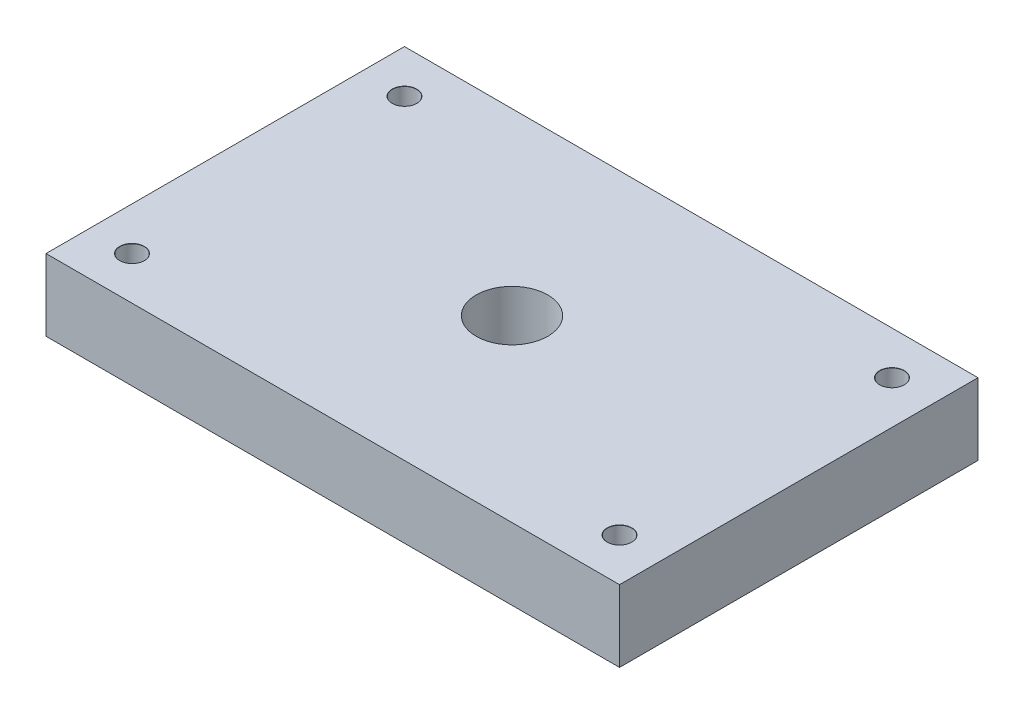
ISO-10303-21;
HEADER;
FILE_DESCRIPTION(('STEP AP214'),'2;1');
FILE_NAME('part.step','',(''),(''),'','','');
FILE_SCHEMA(('AUTOMOTIVE_DESIGN { 1 0 10303 214 1 1 1 1 }'));
ENDSEC;
DATA;
#1=APPLICATION_CONTEXT('core data for automotive mechanical design processes');
#2=APPLICATION_PROTOCOL_DEFINITION('international standard','automotive_design',2000,#1);
#3=PRODUCT_CONTEXT('',#1,'mechanical');
#4=PRODUCT('Part','Part','',(#3));
#5=PRODUCT_RELATED_PRODUCT_CATEGORY('part','',(#4));
#6=PRODUCT_DEFINITION_FORMATION('','',#4);
#7=PRODUCT_DEFINITION_CONTEXT('part definition',#1,'design');
#8=PRODUCT_DEFINITION('design','',#6,#7);
#9=PRODUCT_DEFINITION_SHAPE('','',#8);
#10=(LENGTH_UNIT() NAMED_UNIT(*) SI_UNIT(.MILLI.,.METRE.));
#11=(NAMED_UNIT(*) PLANE_ANGLE_UNIT() SI_UNIT($,.RADIAN.));
#12=(NAMED_UNIT(*) SI_UNIT($,.STERADIAN.) SOLID_ANGLE_UNIT());
#13=UNCERTAINTY_MEASURE_WITH_UNIT(LENGTH_MEASURE(1.E-05),#10,'distance_accuracy_value','');
#14=(GEOMETRIC_REPRESENTATION_CONTEXT(3) GLOBAL_UNCERTAINTY_ASSIGNED_CONTEXT((#13)) GLOBAL_UNIT_ASSIGNED_CONTEXT((#10,
#11,#12)) REPRESENTATION_CONTEXT('',''));
#15=CARTESIAN_POINT('',(0.,0.,0.));
#16=DIRECTION('',(0.,0.,1.));
#17=DIRECTION('',(1.,0.,0.));
#18=AXIS2_PLACEMENT_3D('',#15,#16,#17);
#19=CARTESIAN_POINT('',(40.,10.,25.));
#20=DIRECTION('',(-1.,0.,0.));
#21=DIRECTION('',(0.,0.,1.));
#22=AXIS2_PLACEMENT_3D('',#19,#20,#21);
#23=PLANE('',#22);
#24=DIRECTION('',(0.,0.,-1.));
#25=VECTOR('',#24,1.);
#26=CARTESIAN_POINT('',(40.,0.,25.));
#27=LINE('',#26,#25);
#28=CARTESIAN_POINT('',(40.,0.,25.));
#29=VERTEX_POINT('',#28);
#30=CARTESIAN_POINT('',(40.,0.,-25.));
#31=VERTEX_POINT('',#30);
#32=EDGE_CURVE('E111',#29,#31,#27,.T.);
#33=ORIENTED_EDGE('',*,*,#32,.T.);
#34=DIRECTION('',(0.,-1.,0.));
#35=VECTOR('',#34,1.);
#36=CARTESIAN_POINT('',(40.,10.,-25.));
#37=LINE('',#36,#35);
#38=CARTESIAN_POINT('',(40.,10.,-25.));
#39=VERTEX_POINT('',#38);
#40=EDGE_CURVE('E11',#39,#31,#37,.T.);
#41=ORIENTED_EDGE('',*,*,#40,.F.);
#42=DIRECTION('',(0.,0.,-1.));
#43=VECTOR('',#42,1.);
#44=CARTESIAN_POINT('',(40.,10.,25.));
#45=LINE('',#44,#43);
#46=CARTESIAN_POINT('',(40.,10.,25.));
#47=VERTEX_POINT('',#46);
#48=EDGE_CURVE('E95',#47,#39,#45,.T.);
#49=ORIENTED_EDGE('',*,*,#48,.F.);
#50=DIRECTION('',(0.,-1.,0.));
#51=VECTOR('',#50,1.);
#52=CARTESIAN_POINT('',(40.,10.,25.));
#53=LINE('',#52,#51);
#54=EDGE_CURVE('E107',#47,#29,#53,.T.);
#55=ORIENTED_EDGE('',*,*,#54,.T.);
#56=EDGE_LOOP('',(#33,#41,#49,#55));
#57=FACE_BOUND('',#56,.T.);
#58=ADVANCED_FACE('F43',(#57),#23,.F.);
#59=CARTESIAN_POINT('',(-40.,10.,-25.));
#60=DIRECTION('',(0.,0.,1.));
#61=DIRECTION('',(1.,0.,0.));
#62=AXIS2_PLACEMENT_3D('',#59,#60,#61);
#63=PLANE('',#62);
#64=DIRECTION('',(-1.,0.,0.));
#65=VECTOR('',#64,1.);
#66=CARTESIAN_POINT('',(-40.,0.,-25.));
#67=LINE('',#66,#65);
#68=CARTESIAN_POINT('',(-40.,0.,-25.));
#69=VERTEX_POINT('',#68);
#70=EDGE_CURVE('E100',#31,#69,#67,.T.);
#71=ORIENTED_EDGE('',*,*,#70,.T.);
#72=DIRECTION('',(0.,-1.,0.));
#73=VECTOR('',#72,1.);
#74=CARTESIAN_POINT('',(-40.,10.,-25.));
#75=LINE('',#74,#73);
#76=CARTESIAN_POINT('',(-40.,10.,-25.));
#77=VERTEX_POINT('',#76);
#78=EDGE_CURVE('E52',#77,#69,#75,.T.);
#79=ORIENTED_EDGE('',*,*,#78,.F.);
#80=DIRECTION('',(-1.,0.,0.));
#81=VECTOR('',#80,1.);
#82=CARTESIAN_POINT('',(-40.,10.,-25.));
#83=LINE('',#82,#81);
#84=EDGE_CURVE('E90',#39,#77,#83,.T.);
#85=ORIENTED_EDGE('',*,*,#84,.F.);
#86=ORIENTED_EDGE('',*,*,#40,.T.);
#87=EDGE_LOOP('',(#71,#79,#85,#86));
#88=FACE_BOUND('',#87,.T.);
#89=ADVANCED_FACE('F99',(#88),#63,.F.);
#90=CARTESIAN_POINT('',(-40.,10.,25.));
#91=DIRECTION('',(1.,0.,0.));
#92=DIRECTION('',(0.,0.,-1.));
#93=AXIS2_PLACEMENT_3D('',#90,#91,#92);
#94=PLANE('',#93);
#95=DIRECTION('',(0.,0.,1.));
#96=VECTOR('',#95,1.);
#97=CARTESIAN_POINT('',(-40.,0.,25.));
#98=LINE('',#97,#96);
#99=CARTESIAN_POINT('',(-40.,0.,25.));
#100=VERTEX_POINT('',#99);
#101=EDGE_CURVE('E77',#69,#100,#98,.T.);
#102=ORIENTED_EDGE('',*,*,#101,.T.);
#103=DIRECTION('',(0.,-1.,0.));
#104=VECTOR('',#103,1.);
#105=CARTESIAN_POINT('',(-40.,10.,25.));
#106=LINE('',#105,#104);
#107=CARTESIAN_POINT('',(-40.,10.,25.));
#108=VERTEX_POINT('',#107);
#109=EDGE_CURVE('E102',#108,#100,#106,.T.);
#110=ORIENTED_EDGE('',*,*,#109,.F.);
#111=DIRECTION('',(0.,0.,1.));
#112=VECTOR('',#111,1.);
#113=CARTESIAN_POINT('',(-40.,10.,25.));
#114=LINE('',#113,#112);
#115=EDGE_CURVE('E93',#77,#108,#114,.T.);
#116=ORIENTED_EDGE('',*,*,#115,.F.);
#117=ORIENTED_EDGE('',*,*,#78,.T.);
#118=EDGE_LOOP('',(#102,#110,#116,#117));
#119=FACE_BOUND('',#118,.T.);
#120=ADVANCED_FACE('F103',(#119),#94,.F.);
#121=CARTESIAN_POINT('',(-40.,10.,25.));
#122=DIRECTION('',(0.,0.,-1.));
#123=DIRECTION('',(-1.,0.,0.));
#124=AXIS2_PLACEMENT_3D('',#121,#122,#123);
#125=PLANE('',#124);
#126=DIRECTION('',(1.,0.,0.));
#127=VECTOR('',#126,1.);
#128=CARTESIAN_POINT('',(-40.,0.,25.));
#129=LINE('',#128,#127);
#130=EDGE_CURVE('E83',#100,#29,#129,.T.);
#131=ORIENTED_EDGE('',*,*,#130,.T.);
#132=ORIENTED_EDGE('',*,*,#54,.F.);
#133=DIRECTION('',(1.,0.,0.));
#134=VECTOR('',#133,1.);
#135=CARTESIAN_POINT('',(-40.,10.,25.));
#136=LINE('',#135,#134);
#137=EDGE_CURVE('E60',#108,#47,#136,.T.);
#138=ORIENTED_EDGE('',*,*,#137,.F.);
#139=ORIENTED_EDGE('',*,*,#109,.T.);
#140=EDGE_LOOP('',(#131,#132,#138,#139));
#141=FACE_BOUND('',#140,.T.);
#142=ADVANCED_FACE('F125',(#141),#125,.F.);
#143=CARTESIAN_POINT('',(0.,10.,0.));
#144=DIRECTION('',(0.,-1.,0.));
#145=DIRECTION('',(0.,0.,-1.));
#146=AXIS2_PLACEMENT_3D('',#143,#144,#145);
#147=PLANE('',#146);
#148=CARTESIAN_POINT('',(-34.,10.,-19.));
#149=DIRECTION('',(0.,1.,0.));
#150=DIRECTION('',(0.,0.,1.));
#151=AXIS2_PLACEMENT_3D('',#148,#149,#150);
#152=CIRCLE('',#151,1.725);
#153=CARTESIAN_POINT('',(-34.,10.,-17.275));
#154=VERTEX_POINT('',#153);
#155=EDGE_CURVE('E183',#154,#154,#152,.T.);
#156=ORIENTED_EDGE('',*,*,#155,.F.);
#157=EDGE_LOOP('',(#156));
#158=FACE_BOUND('',#157,.T.);
#159=CARTESIAN_POINT('',(34.,10.,-19.));
#160=DIRECTION('',(0.,1.,0.));
#161=DIRECTION('',(0.,0.,1.));
#162=AXIS2_PLACEMENT_3D('',#159,#160,#161);
#163=CIRCLE('',#162,1.725);
#164=CARTESIAN_POINT('',(34.,10.,-17.275));
#165=VERTEX_POINT('',#164);
#166=EDGE_CURVE('E171',#165,#165,#163,.T.);
#167=ORIENTED_EDGE('',*,*,#166,.F.);
#168=EDGE_LOOP('',(#167));
#169=FACE_BOUND('',#168,.T.);
#170=CARTESIAN_POINT('',(-34.,10.,19.));
#171=DIRECTION('',(0.,1.,0.));
#172=DIRECTION('',(0.,0.,1.));
#173=AXIS2_PLACEMENT_3D('',#170,#171,#172);
#174=CIRCLE('',#173,1.725);
#175=CARTESIAN_POINT('',(-34.,10.,20.725));
#176=VERTEX_POINT('',#175);
#177=EDGE_CURVE('E159',#176,#176,#174,.T.);
#178=ORIENTED_EDGE('',*,*,#177,.F.);
#179=EDGE_LOOP('',(#178));
#180=FACE_BOUND('',#179,.T.);
#181=CARTESIAN_POINT('',(34.,10.,19.));
#182=DIRECTION('',(0.,1.,0.));
#183=DIRECTION('',(0.,0.,1.));
#184=AXIS2_PLACEMENT_3D('',#181,#182,#183);
#185=CIRCLE('',#184,1.725);
#186=CARTESIAN_POINT('',(34.,10.,20.725));
#187=VERTEX_POINT('',#186);
#188=EDGE_CURVE('E147',#187,#187,#185,.T.);
#189=ORIENTED_EDGE('',*,*,#188,.F.);
#190=EDGE_LOOP('',(#189));
#191=FACE_BOUND('',#190,.T.);
#192=CARTESIAN_POINT('',(0.,10.,0.));
#193=DIRECTION('',(0.,1.,0.));
#194=DIRECTION('',(0.,0.,1.));
#195=AXIS2_PLACEMENT_3D('',#192,#193,#194);
#196=CIRCLE('',#195,5.);
#197=CARTESIAN_POINT('',(0.,10.,5.));
#198=VERTEX_POINT('',#197);
#199=EDGE_CURVE('E132',#198,#198,#196,.T.);
#200=ORIENTED_EDGE('',*,*,#199,.F.);
#201=EDGE_LOOP('',(#200));
#202=FACE_BOUND('',#201,.T.);
#203=ORIENTED_EDGE('',*,*,#48,.T.);
#204=ORIENTED_EDGE('',*,*,#84,.T.);
#205=ORIENTED_EDGE('',*,*,#115,.T.);
#206=ORIENTED_EDGE('',*,*,#137,.T.);
#207=EDGE_LOOP('',(#203,#204,#205,#206));
#208=FACE_BOUND('',#207,.T.);
#209=ADVANCED_FACE('F91',(#158,#169,#180,#191,#202,#208),#147,.F.);
#210=CARTESIAN_POINT('',(0.,0.,0.));
#211=DIRECTION('',(0.,-1.,0.));
#212=DIRECTION('',(0.,0.,-1.));
#213=AXIS2_PLACEMENT_3D('',#210,#211,#212);
#214=PLANE('',#213);
#215=CARTESIAN_POINT('',(-34.,0.,-19.));
#216=DIRECTION('',(0.,1.,0.));
#217=DIRECTION('',(0.,0.,1.));
#218=AXIS2_PLACEMENT_3D('',#215,#216,#217);
#219=CIRCLE('',#218,1.7);
#220=CARTESIAN_POINT('',(-34.,0.,-17.3));
#221=VERTEX_POINT('',#220);
#222=EDGE_CURVE('E175',#221,#221,#219,.T.);
#223=ORIENTED_EDGE('',*,*,#222,.T.);
#224=EDGE_LOOP('',(#223));
#225=FACE_BOUND('',#224,.T.);
#226=CARTESIAN_POINT('',(34.,0.,-19.));
#227=DIRECTION('',(0.,1.,0.));
#228=DIRECTION('',(0.,0.,1.));
#229=AXIS2_PLACEMENT_3D('',#226,#227,#228);
#230=CIRCLE('',#229,1.7);
#231=CARTESIAN_POINT('',(34.,0.,-17.3));
#232=VERTEX_POINT('',#231);
#233=EDGE_CURVE('E163',#232,#232,#230,.T.);
#234=ORIENTED_EDGE('',*,*,#233,.T.);
#235=EDGE_LOOP('',(#234));
#236=FACE_BOUND('',#235,.T.);
#237=CARTESIAN_POINT('',(-34.,0.,19.));
#238=DIRECTION('',(0.,1.,0.));
#239=DIRECTION('',(0.,0.,1.));
#240=AXIS2_PLACEMENT_3D('',#237,#238,#239);
#241=CIRCLE('',#240,1.7);
#242=CARTESIAN_POINT('',(-34.,0.,20.7));
#243=VERTEX_POINT('',#242);
#244=EDGE_CURVE('E151',#243,#243,#241,.T.);
#245=ORIENTED_EDGE('',*,*,#244,.T.);
#246=EDGE_LOOP('',(#245));
#247=FACE_BOUND('',#246,.T.);
#248=CARTESIAN_POINT('',(34.,0.,19.));
#249=DIRECTION('',(0.,1.,0.));
#250=DIRECTION('',(0.,0.,1.));
#251=AXIS2_PLACEMENT_3D('',#248,#249,#250);
#252=CIRCLE('',#251,1.7);
#253=CARTESIAN_POINT('',(34.,0.,20.7));
#254=VERTEX_POINT('',#253);
#255=EDGE_CURVE('E136',#254,#254,#252,.T.);
#256=ORIENTED_EDGE('',*,*,#255,.T.);
#257=EDGE_LOOP('',(#256));
#258=FACE_BOUND('',#257,.T.);
#259=CARTESIAN_POINT('',(0.,0.,0.));
#260=DIRECTION('',(0.,1.,0.));
#261=DIRECTION('',(0.,0.,1.));
#262=AXIS2_PLACEMENT_3D('',#259,#260,#261);
#263=CIRCLE('',#262,5.);
#264=CARTESIAN_POINT('',(0.,0.,5.));
#265=VERTEX_POINT('',#264);
#266=EDGE_CURVE('E115',#265,#265,#263,.T.);
#267=ORIENTED_EDGE('',*,*,#266,.T.);
#268=EDGE_LOOP('',(#267));
#269=FACE_BOUND('',#268,.T.);
#270=ORIENTED_EDGE('',*,*,#32,.F.);
#271=ORIENTED_EDGE('',*,*,#130,.F.);
#272=ORIENTED_EDGE('',*,*,#101,.F.);
#273=ORIENTED_EDGE('',*,*,#70,.F.);
#274=EDGE_LOOP('',(#270,#271,#272,#273));
#275=FACE_BOUND('',#274,.T.);
#276=ADVANCED_FACE('F128',(#225,#236,#247,#258,#269,#275),#214,.T.);
#277=CARTESIAN_POINT('',(0.,0.,0.));
#278=DIRECTION('',(0.,1.,0.));
#279=DIRECTION('',(0.,0.,1.));
#280=AXIS2_PLACEMENT_3D('',#277,#278,#279);
#281=CYLINDRICAL_SURFACE('',#280,5.);
#282=ORIENTED_EDGE('',*,*,#266,.F.);
#283=EDGE_LOOP('',(#282));
#284=FACE_BOUND('',#283,.T.);
#285=ORIENTED_EDGE('',*,*,#199,.T.);
#286=EDGE_LOOP('',(#285));
#287=FACE_BOUND('',#286,.T.);
#288=ADVANCED_FACE('F201',(#284,#287),#281,.F.);
#289=CARTESIAN_POINT('',(34.,10.,19.));
#290=DIRECTION('',(0.,1.,0.));
#291=DIRECTION('',(0.,0.,1.));
#292=AXIS2_PLACEMENT_3D('',#289,#290,#291);
#293=CYLINDRICAL_SURFACE('',#292,1.69999999999999);
#294=ORIENTED_EDGE('',*,*,#255,.F.);
#295=EDGE_LOOP('',(#294));
#296=FACE_BOUND('',#295,.T.);
#297=CARTESIAN_POINT('',(34.,9.97499999999997,19.));
#298=DIRECTION('',(0.,1.,0.));
#299=DIRECTION('',(0.,0.,1.));
#300=AXIS2_PLACEMENT_3D('',#297,#298,#299);
#301=CIRCLE('',#300,1.69999999999999);
#302=CARTESIAN_POINT('',(34.,9.97499999999997,20.7));
#303=VERTEX_POINT('',#302);
#304=EDGE_CURVE('E143',#303,#303,#301,.T.);
#305=ORIENTED_EDGE('',*,*,#304,.T.);
#306=EDGE_LOOP('',(#305));
#307=FACE_BOUND('',#306,.T.);
#308=ADVANCED_FACE('F203',(#296,#307),#293,.F.);
#309=CARTESIAN_POINT('',(34.,10.,19.));
#310=DIRECTION('',(0.,1.,0.));
#311=DIRECTION('',(0.,0.,1.));
#312=AXIS2_PLACEMENT_3D('',#309,#310,#311);
#313=CONICAL_SURFACE('',#312,1.725,0.785398163397275);
#314=ORIENTED_EDGE('',*,*,#304,.F.);
#315=EDGE_LOOP('',(#314));
#316=FACE_BOUND('',#315,.T.);
#317=ORIENTED_EDGE('',*,*,#188,.T.);
#318=EDGE_LOOP('',(#317));
#319=FACE_BOUND('',#318,.T.);
#320=ADVANCED_FACE('F210',(#316,#319),#313,.F.);
#321=CARTESIAN_POINT('',(-34.,10.,19.));
#322=DIRECTION('',(0.,1.,0.));
#323=DIRECTION('',(0.,0.,1.));
#324=AXIS2_PLACEMENT_3D('',#321,#322,#323);
#325=CYLINDRICAL_SURFACE('',#324,1.69999999999999);
#326=ORIENTED_EDGE('',*,*,#244,.F.);
#327=EDGE_LOOP('',(#326));
#328=FACE_BOUND('',#327,.T.);
#329=CARTESIAN_POINT('',(-34.,9.97499999999997,19.));
#330=DIRECTION('',(0.,1.,0.));
#331=DIRECTION('',(0.,0.,1.));
#332=AXIS2_PLACEMENT_3D('',#329,#330,#331);
#333=CIRCLE('',#332,1.69999999999999);
#334=CARTESIAN_POINT('',(-34.,9.97499999999997,20.7));
#335=VERTEX_POINT('',#334);
#336=EDGE_CURVE('E155',#335,#335,#333,.T.);
#337=ORIENTED_EDGE('',*,*,#336,.T.);
#338=EDGE_LOOP('',(#337));
#339=FACE_BOUND('',#338,.T.);
#340=ADVANCED_FACE('F256',(#328,#339),#325,.F.);
#341=CARTESIAN_POINT('',(-34.,10.,19.));
#342=DIRECTION('',(0.,1.,0.));
#343=DIRECTION('',(0.,0.,1.));
#344=AXIS2_PLACEMENT_3D('',#341,#342,#343);
#345=CONICAL_SURFACE('',#344,1.725,0.785398163397136);
#346=ORIENTED_EDGE('',*,*,#336,.F.);
#347=EDGE_LOOP('',(#346));
#348=FACE_BOUND('',#347,.T.);
#349=ORIENTED_EDGE('',*,*,#177,.T.);
#350=EDGE_LOOP('',(#349));
#351=FACE_BOUND('',#350,.T.);
#352=ADVANCED_FACE('F267',(#348,#351),#345,.F.);
#353=CARTESIAN_POINT('',(34.,10.,-19.));
#354=DIRECTION('',(0.,1.,0.));
#355=DIRECTION('',(0.,0.,1.));
#356=AXIS2_PLACEMENT_3D('',#353,#354,#355);
#357=CYLINDRICAL_SURFACE('',#356,1.69999999999999);
#358=ORIENTED_EDGE('',*,*,#233,.F.);
#359=EDGE_LOOP('',(#358));
#360=FACE_BOUND('',#359,.T.);
#361=CARTESIAN_POINT('',(34.,9.97499999999997,-19.));
#362=DIRECTION('',(0.,1.,0.));
#363=DIRECTION('',(0.,0.,1.));
#364=AXIS2_PLACEMENT_3D('',#361,#362,#363);
#365=CIRCLE('',#364,1.69999999999999);
#366=CARTESIAN_POINT('',(34.,9.97499999999997,-17.3));
#367=VERTEX_POINT('',#366);
#368=EDGE_CURVE('E167',#367,#367,#365,.T.);
#369=ORIENTED_EDGE('',*,*,#368,.T.);
#370=EDGE_LOOP('',(#369));
#371=FACE_BOUND('',#370,.T.);
#372=ADVANCED_FACE('F278',(#360,#371),#357,.F.);
#373=CARTESIAN_POINT('',(34.,10.,-19.));
#374=DIRECTION('',(0.,1.,0.));
#375=DIRECTION('',(0.,0.,1.));
#376=AXIS2_PLACEMENT_3D('',#373,#374,#375);
#377=CONICAL_SURFACE('',#376,1.725,0.785398163397136);
#378=ORIENTED_EDGE('',*,*,#368,.F.);
#379=EDGE_LOOP('',(#378));
#380=FACE_BOUND('',#379,.T.);
#381=ORIENTED_EDGE('',*,*,#166,.T.);
#382=EDGE_LOOP('',(#381));
#383=FACE_BOUND('',#382,.T.);
#384=ADVANCED_FACE('F289',(#380,#383),#377,.F.);
#385=CARTESIAN_POINT('',(-34.,10.,-19.));
#386=DIRECTION('',(0.,1.,0.));
#387=DIRECTION('',(0.,0.,1.));
#388=AXIS2_PLACEMENT_3D('',#385,#386,#387);
#389=CYLINDRICAL_SURFACE('',#388,1.69999999999999);
#390=ORIENTED_EDGE('',*,*,#222,.F.);
#391=EDGE_LOOP('',(#390));
#392=FACE_BOUND('',#391,.T.);
#393=CARTESIAN_POINT('',(-34.,9.97499999999997,-19.));
#394=DIRECTION('',(0.,1.,0.));
#395=DIRECTION('',(0.,0.,1.));
#396=AXIS2_PLACEMENT_3D('',#393,#394,#395);
#397=CIRCLE('',#396,1.69999999999999);
#398=CARTESIAN_POINT('',(-34.,9.97499999999997,-17.3));
#399=VERTEX_POINT('',#398);
#400=EDGE_CURVE('E179',#399,#399,#397,.T.);
#401=ORIENTED_EDGE('',*,*,#400,.T.);
#402=EDGE_LOOP('',(#401));
#403=FACE_BOUND('',#402,.T.);
#404=ADVANCED_FACE('F300',(#392,#403),#389,.F.);
#405=CARTESIAN_POINT('',(-34.,10.,-19.));
#406=DIRECTION('',(0.,1.,0.));
#407=DIRECTION('',(0.,0.,1.));
#408=AXIS2_PLACEMENT_3D('',#405,#406,#407);
#409=CONICAL_SURFACE('',#408,1.725,0.785398163397136);
#410=ORIENTED_EDGE('',*,*,#400,.F.);
#411=EDGE_LOOP('',(#410));
#412=FACE_BOUND('',#411,.T.);
#413=ORIENTED_EDGE('',*,*,#155,.T.);
#414=EDGE_LOOP('',(#413));
#415=FACE_BOUND('',#414,.T.);
#416=ADVANCED_FACE('F188',(#412,#415),#409,.F.);
#417=CLOSED_SHELL('',(#58,#89,#120,#142,#209,#276,#288,#308,#320,#340,#352,#372,#384,#404,#416));
#418=MANIFOLD_SOLID_BREP('B2',#417);
#419=ADVANCED_BREP_SHAPE_REPRESENTATION('',(#18,#418),#14);
#420=SHAPE_DEFINITION_REPRESENTATION(#9,#419);
ENDSEC;
END-ISO-10303-21;
